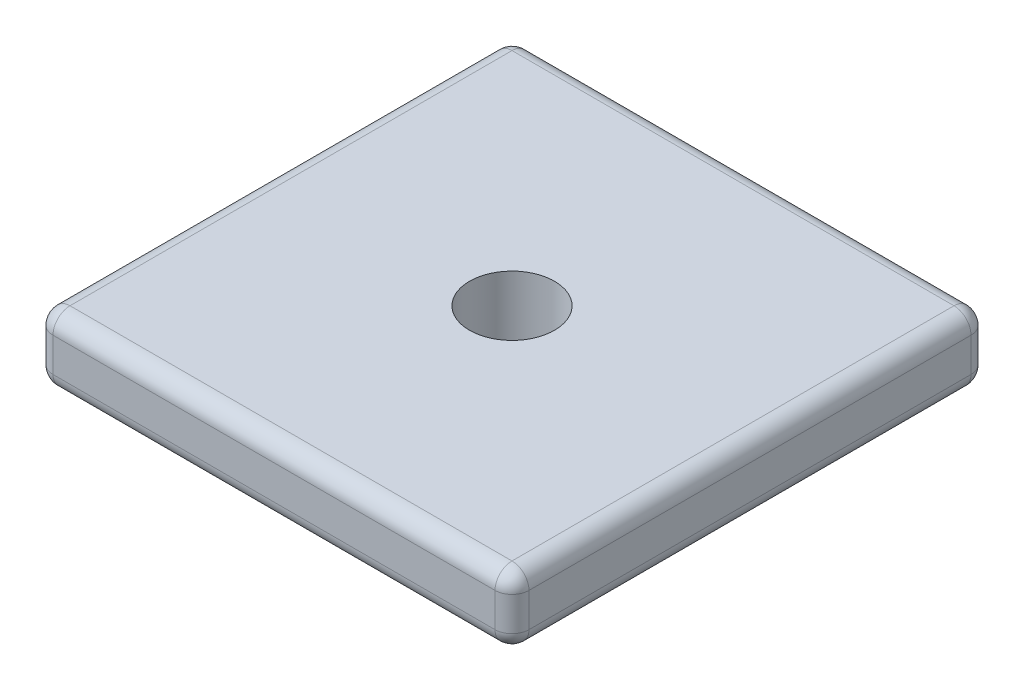
ISO-10303-21;
HEADER;
FILE_DESCRIPTION(('STEP AP214'),'2;1');
FILE_NAME('part.step','',(''),(''),'','','');
FILE_SCHEMA(('AUTOMOTIVE_DESIGN { 1 0 10303 214 1 1 1 1 }'));
ENDSEC;
DATA;
#1=APPLICATION_CONTEXT('core data for automotive mechanical design processes');
#2=APPLICATION_PROTOCOL_DEFINITION('international standard','automotive_design',2000,#1);
#3=PRODUCT_CONTEXT('',#1,'mechanical');
#4=PRODUCT('Part','Part','',(#3));
#5=PRODUCT_RELATED_PRODUCT_CATEGORY('part','',(#4));
#6=PRODUCT_DEFINITION_FORMATION('','',#4);
#7=PRODUCT_DEFINITION_CONTEXT('part definition',#1,'design');
#8=PRODUCT_DEFINITION('design','',#6,#7);
#9=PRODUCT_DEFINITION_SHAPE('','',#8);
#10=(LENGTH_UNIT() NAMED_UNIT(*) SI_UNIT(.MILLI.,.METRE.));
#11=(NAMED_UNIT(*) PLANE_ANGLE_UNIT() SI_UNIT($,.RADIAN.));
#12=(NAMED_UNIT(*) SI_UNIT($,.STERADIAN.) SOLID_ANGLE_UNIT());
#13=UNCERTAINTY_MEASURE_WITH_UNIT(LENGTH_MEASURE(1.E-05),#10,'distance_accuracy_value','');
#14=(GEOMETRIC_REPRESENTATION_CONTEXT(3) GLOBAL_UNCERTAINTY_ASSIGNED_CONTEXT((#13)) GLOBAL_UNIT_ASSIGNED_CONTEXT((#10,
#11,#12)) REPRESENTATION_CONTEXT('',''));
#15=CARTESIAN_POINT('',(0.,0.,0.));
#16=DIRECTION('',(0.,0.,1.));
#17=DIRECTION('',(1.,0.,0.));
#18=AXIS2_PLACEMENT_3D('',#15,#16,#17);
#19=CARTESIAN_POINT('',(-84.1666666666667,2.,-56.));
#20=DIRECTION('',(1.,0.,0.));
#21=DIRECTION('',(0.,0.,-1.));
#22=AXIS2_PLACEMENT_3D('',#19,#20,#21);
#23=PLANE('',#22);
#24=DIRECTION('',(0.,0.,1.));
#25=VECTOR('',#24,1.);
#26=CARTESIAN_POINT('',(-84.1666666666667,1.5,-70.));
#27=LINE('',#26,#25);
#28=CARTESIAN_POINT('',(-84.1666666666667,1.5,-56.5));
#29=VERTEX_POINT('',#28);
#30=CARTESIAN_POINT('',(-84.1666666666667,1.5,-69.5));
#31=VERTEX_POINT('',#30);
#32=EDGE_CURVE('E124',#29,#31,#27,.F.);
#33=ORIENTED_EDGE('',*,*,#32,.T.);
#34=DIRECTION('',(0.,-1.,0.));
#35=VECTOR('',#34,1.);
#36=CARTESIAN_POINT('',(-84.1666666666667,2.,-69.5));
#37=LINE('',#36,#35);
#38=CARTESIAN_POINT('',(-84.1666666666667,0.5,-69.5));
#39=VERTEX_POINT('',#38);
#40=EDGE_CURVE('E164',#31,#39,#37,.T.);
#41=ORIENTED_EDGE('',*,*,#40,.T.);
#42=DIRECTION('',(0.,0.,1.));
#43=VECTOR('',#42,1.);
#44=CARTESIAN_POINT('',(-84.1666666666667,0.5,-56.));
#45=LINE('',#44,#43);
#46=CARTESIAN_POINT('',(-84.1666666666667,0.5,-56.5));
#47=VERTEX_POINT('',#46);
#48=EDGE_CURVE('E127',#39,#47,#45,.T.);
#49=ORIENTED_EDGE('',*,*,#48,.T.);
#50=DIRECTION('',(0.,-1.,0.));
#51=VECTOR('',#50,1.);
#52=CARTESIAN_POINT('',(-84.1666666666667,2.,-56.5));
#53=LINE('',#52,#51);
#54=EDGE_CURVE('E120',#47,#29,#53,.F.);
#55=ORIENTED_EDGE('',*,*,#54,.T.);
#56=EDGE_LOOP('',(#33,#41,#49,#55));
#57=FACE_BOUND('',#56,.T.);
#58=ADVANCED_FACE('F33',(#57),#23,.F.);
#59=CARTESIAN_POINT('',(-70.1666666666667,2.,-56.));
#60=DIRECTION('',(0.,0.,-1.));
#61=DIRECTION('',(-1.,0.,0.));
#62=AXIS2_PLACEMENT_3D('',#59,#60,#61);
#63=PLANE('',#62);
#64=DIRECTION('',(1.,0.,0.));
#65=VECTOR('',#64,1.);
#66=CARTESIAN_POINT('',(-84.1666666666667,1.5,-56.));
#67=LINE('',#66,#65);
#68=CARTESIAN_POINT('',(-70.6666666666667,1.5,-56.));
#69=VERTEX_POINT('',#68);
#70=CARTESIAN_POINT('',(-83.6666666666667,1.5,-56.));
#71=VERTEX_POINT('',#70);
#72=EDGE_CURVE('E186',#69,#71,#67,.F.);
#73=ORIENTED_EDGE('',*,*,#72,.T.);
#74=DIRECTION('',(0.,-1.,0.));
#75=VECTOR('',#74,1.);
#76=CARTESIAN_POINT('',(-83.6666666666667,2.,-56.));
#77=LINE('',#76,#75);
#78=CARTESIAN_POINT('',(-83.6666666666667,0.5,-56.));
#79=VERTEX_POINT('',#78);
#80=EDGE_CURVE('E138',#71,#79,#77,.T.);
#81=ORIENTED_EDGE('',*,*,#80,.T.);
#82=DIRECTION('',(1.,0.,0.));
#83=VECTOR('',#82,1.);
#84=CARTESIAN_POINT('',(-70.1666666666667,0.5,-56.));
#85=LINE('',#84,#83);
#86=CARTESIAN_POINT('',(-70.6666666666667,0.5,-56.));
#87=VERTEX_POINT('',#86);
#88=EDGE_CURVE('E188',#79,#87,#85,.T.);
#89=ORIENTED_EDGE('',*,*,#88,.T.);
#90=DIRECTION('',(0.,-1.,0.));
#91=VECTOR('',#90,1.);
#92=CARTESIAN_POINT('',(-70.6666666666667,2.,-56.));
#93=LINE('',#92,#91);
#94=EDGE_CURVE('E184',#87,#69,#93,.F.);
#95=ORIENTED_EDGE('',*,*,#94,.T.);
#96=EDGE_LOOP('',(#73,#81,#89,#95));
#97=FACE_BOUND('',#96,.T.);
#98=ADVANCED_FACE('F296',(#97),#63,.F.);
#99=CARTESIAN_POINT('',(-70.1666666666667,2.,-56.));
#100=DIRECTION('',(-1.,0.,0.));
#101=DIRECTION('',(0.,0.,1.));
#102=AXIS2_PLACEMENT_3D('',#99,#100,#101);
#103=PLANE('',#102);
#104=DIRECTION('',(0.,0.,-1.));
#105=VECTOR('',#104,1.);
#106=CARTESIAN_POINT('',(-70.1666666666667,1.5,-56.));
#107=LINE('',#106,#105);
#108=CARTESIAN_POINT('',(-70.1666666666667,1.5,-69.5));
#109=VERTEX_POINT('',#108);
#110=CARTESIAN_POINT('',(-70.1666666666667,1.5,-56.5));
#111=VERTEX_POINT('',#110);
#112=EDGE_CURVE('E42',#109,#111,#107,.F.);
#113=ORIENTED_EDGE('',*,*,#112,.T.);
#114=DIRECTION('',(0.,-1.,0.));
#115=VECTOR('',#114,1.);
#116=CARTESIAN_POINT('',(-70.1666666666667,2.,-56.5));
#117=LINE('',#116,#115);
#118=CARTESIAN_POINT('',(-70.1666666666667,0.5,-56.5));
#119=VERTEX_POINT('',#118);
#120=EDGE_CURVE('E11',#111,#119,#117,.T.);
#121=ORIENTED_EDGE('',*,*,#120,.T.);
#122=DIRECTION('',(0.,0.,-1.));
#123=VECTOR('',#122,1.);
#124=CARTESIAN_POINT('',(-70.1666666666667,0.5,-56.));
#125=LINE('',#124,#123);
#126=CARTESIAN_POINT('',(-70.1666666666667,0.5,-69.5));
#127=VERTEX_POINT('',#126);
#128=EDGE_CURVE('E200',#119,#127,#125,.T.);
#129=ORIENTED_EDGE('',*,*,#128,.T.);
#130=DIRECTION('',(0.,-1.,0.));
#131=VECTOR('',#130,1.);
#132=CARTESIAN_POINT('',(-70.1666666666667,2.,-69.5));
#133=LINE('',#132,#131);
#134=EDGE_CURVE('E53',#127,#109,#133,.F.);
#135=ORIENTED_EDGE('',*,*,#134,.T.);
#136=EDGE_LOOP('',(#113,#121,#129,#135));
#137=FACE_BOUND('',#136,.T.);
#138=ADVANCED_FACE('F274',(#137),#103,.F.);
#139=CARTESIAN_POINT('',(-70.1666666666667,2.,-70.));
#140=DIRECTION('',(0.,0.,1.));
#141=DIRECTION('',(1.,0.,0.));
#142=AXIS2_PLACEMENT_3D('',#139,#140,#141);
#143=PLANE('',#142);
#144=DIRECTION('',(-1.,0.,0.));
#145=VECTOR('',#144,1.);
#146=CARTESIAN_POINT('',(-70.1666666666667,0.5,-70.));
#147=LINE('',#146,#145);
#148=CARTESIAN_POINT('',(-70.6666666666667,0.5,-70.));
#149=VERTEX_POINT('',#148);
#150=CARTESIAN_POINT('',(-83.6666666666667,0.5,-70.));
#151=VERTEX_POINT('',#150);
#152=EDGE_CURVE('E170',#149,#151,#147,.T.);
#153=ORIENTED_EDGE('',*,*,#152,.T.);
#154=DIRECTION('',(0.,-1.,0.));
#155=VECTOR('',#154,1.);
#156=CARTESIAN_POINT('',(-83.6666666666667,2.,-70.));
#157=LINE('',#156,#155);
#158=CARTESIAN_POINT('',(-83.6666666666667,1.5,-70.));
#159=VERTEX_POINT('',#158);
#160=EDGE_CURVE('E172',#151,#159,#157,.F.);
#161=ORIENTED_EDGE('',*,*,#160,.T.);
#162=DIRECTION('',(-1.,0.,0.));
#163=VECTOR('',#162,1.);
#164=CARTESIAN_POINT('',(-70.1666666666667,1.5,-70.));
#165=LINE('',#164,#163);
#166=CARTESIAN_POINT('',(-70.6666666666667,1.5,-70.));
#167=VERTEX_POINT('',#166);
#168=EDGE_CURVE('E168',#159,#167,#165,.F.);
#169=ORIENTED_EDGE('',*,*,#168,.T.);
#170=DIRECTION('',(0.,-1.,0.));
#171=VECTOR('',#170,1.);
#172=CARTESIAN_POINT('',(-70.6666666666667,2.,-70.));
#173=LINE('',#172,#171);
#174=EDGE_CURVE('E166',#167,#149,#173,.T.);
#175=ORIENTED_EDGE('',*,*,#174,.T.);
#176=EDGE_LOOP('',(#153,#161,#169,#175));
#177=FACE_BOUND('',#176,.T.);
#178=ADVANCED_FACE('F409',(#177),#143,.F.);
#179=CARTESIAN_POINT('',(0.,2.,0.));
#180=DIRECTION('',(0.,1.,0.));
#181=DIRECTION('',(0.,0.,1.));
#182=AXIS2_PLACEMENT_3D('',#179,#180,#181);
#183=PLANE('',#182);
#184=CARTESIAN_POINT('',(-77.1666666666667,2.,-63.));
#185=DIRECTION('',(0.,1.,0.));
#186=DIRECTION('',(0.,0.,1.));
#187=AXIS2_PLACEMENT_3D('',#184,#185,#186);
#188=CIRCLE('',#187,1.25);
#189=CARTESIAN_POINT('',(-77.1666666666667,2.,-61.75));
#190=VERTEX_POINT('',#189);
#191=EDGE_CURVE('E160',#190,#190,#188,.T.);
#192=ORIENTED_EDGE('',*,*,#191,.F.);
#193=EDGE_LOOP('',(#192));
#194=FACE_BOUND('',#193,.T.);
#195=DIRECTION('',(-1.,0.,0.));
#196=VECTOR('',#195,1.);
#197=CARTESIAN_POINT('',(-84.1666666666667,2.,-69.5));
#198=LINE('',#197,#196);
#199=CARTESIAN_POINT('',(-70.6666666666667,2.,-69.5));
#200=VERTEX_POINT('',#199);
#201=CARTESIAN_POINT('',(-83.6666666666667,2.,-69.5));
#202=VERTEX_POINT('',#201);
#203=EDGE_CURVE('E195',#200,#202,#198,.T.);
#204=ORIENTED_EDGE('',*,*,#203,.T.);
#205=DIRECTION('',(0.,0.,1.));
#206=VECTOR('',#205,1.);
#207=CARTESIAN_POINT('',(-83.6666666666667,2.,-56.));
#208=LINE('',#207,#206);
#209=CARTESIAN_POINT('',(-83.6666666666667,2.,-56.5));
#210=VERTEX_POINT('',#209);
#211=EDGE_CURVE('E198',#202,#210,#208,.T.);
#212=ORIENTED_EDGE('',*,*,#211,.T.);
#213=DIRECTION('',(1.,0.,0.));
#214=VECTOR('',#213,1.);
#215=CARTESIAN_POINT('',(-70.1666666666667,2.,-56.5));
#216=LINE('',#215,#214);
#217=CARTESIAN_POINT('',(-70.6666666666667,2.,-56.5));
#218=VERTEX_POINT('',#217);
#219=EDGE_CURVE('E193',#210,#218,#216,.T.);
#220=ORIENTED_EDGE('',*,*,#219,.T.);
#221=DIRECTION('',(0.,0.,-1.));
#222=VECTOR('',#221,1.);
#223=CARTESIAN_POINT('',(-70.6666666666667,2.,-70.));
#224=LINE('',#223,#222);
#225=EDGE_CURVE('E191',#218,#200,#224,.T.);
#226=ORIENTED_EDGE('',*,*,#225,.T.);
#227=EDGE_LOOP('',(#204,#212,#220,#226));
#228=FACE_BOUND('',#227,.T.);
#229=ADVANCED_FACE('F301',(#194,#228),#183,.T.);
#230=CARTESIAN_POINT('',(0.,0.,0.));
#231=DIRECTION('',(0.,1.,0.));
#232=DIRECTION('',(0.,0.,1.));
#233=AXIS2_PLACEMENT_3D('',#230,#231,#232);
#234=PLANE('',#233);
#235=CARTESIAN_POINT('',(-77.1666666666667,0.,-63.));
#236=DIRECTION('',(0.,1.,0.));
#237=DIRECTION('',(0.,0.,1.));
#238=AXIS2_PLACEMENT_3D('',#235,#236,#237);
#239=CIRCLE('',#238,1.25);
#240=CARTESIAN_POINT('',(-77.1666666666667,0.,-61.75));
#241=VERTEX_POINT('',#240);
#242=EDGE_CURVE('E207',#241,#241,#239,.T.);
#243=ORIENTED_EDGE('',*,*,#242,.T.);
#244=EDGE_LOOP('',(#243));
#245=FACE_BOUND('',#244,.T.);
#246=DIRECTION('',(0.,0.,1.));
#247=VECTOR('',#246,1.);
#248=CARTESIAN_POINT('',(-83.6666666666667,0.,0.));
#249=LINE('',#248,#247);
#250=CARTESIAN_POINT('',(-83.6666666666667,0.,-56.5));
#251=VERTEX_POINT('',#250);
#252=CARTESIAN_POINT('',(-83.6666666666667,0.,-69.5));
#253=VERTEX_POINT('',#252);
#254=EDGE_CURVE('E179',#251,#253,#249,.F.);
#255=ORIENTED_EDGE('',*,*,#254,.T.);
#256=DIRECTION('',(-1.,0.,0.));
#257=VECTOR('',#256,1.);
#258=CARTESIAN_POINT('',(0.,0.,-69.5000000000001));
#259=LINE('',#258,#257);
#260=CARTESIAN_POINT('',(-70.6666666666667,0.,-69.5));
#261=VERTEX_POINT('',#260);
#262=EDGE_CURVE('E181',#253,#261,#259,.F.);
#263=ORIENTED_EDGE('',*,*,#262,.T.);
#264=DIRECTION('',(0.,0.,-1.));
#265=VECTOR('',#264,1.);
#266=CARTESIAN_POINT('',(-70.6666666666668,0.,0.));
#267=LINE('',#266,#265);
#268=CARTESIAN_POINT('',(-70.6666666666667,0.,-56.5));
#269=VERTEX_POINT('',#268);
#270=EDGE_CURVE('E175',#261,#269,#267,.F.);
#271=ORIENTED_EDGE('',*,*,#270,.T.);
#272=DIRECTION('',(1.,0.,0.));
#273=VECTOR('',#272,1.);
#274=CARTESIAN_POINT('',(0.,0.,-56.5000000000001));
#275=LINE('',#274,#273);
#276=EDGE_CURVE('E177',#269,#251,#275,.F.);
#277=ORIENTED_EDGE('',*,*,#276,.T.);
#278=EDGE_LOOP('',(#255,#263,#271,#277));
#279=FACE_BOUND('',#278,.T.);
#280=ADVANCED_FACE('F267',(#245,#279),#234,.F.);
#281=CARTESIAN_POINT('',(-70.6666666666667,2.,-56.5));
#282=DIRECTION('',(0.,-1.,0.));
#283=DIRECTION('',(0.,0.,-1.));
#284=AXIS2_PLACEMENT_3D('',#281,#282,#283);
#285=CYLINDRICAL_SURFACE('',#284,0.5);
#286=CARTESIAN_POINT('',(-70.6666666666667,1.5,-56.5));
#287=DIRECTION('',(0.,1.,0.));
#288=DIRECTION('',(0.,0.,1.));
#289=AXIS2_PLACEMENT_3D('',#286,#287,#288);
#290=CIRCLE('',#289,0.5);
#291=EDGE_CURVE('E37',#69,#111,#290,.T.);
#292=ORIENTED_EDGE('',*,*,#291,.F.);
#293=ORIENTED_EDGE('',*,*,#94,.F.);
#294=CARTESIAN_POINT('',(-70.6666666666667,0.5,-56.5));
#295=DIRECTION('',(0.,-1.,0.));
#296=DIRECTION('',(0.,0.,-1.));
#297=AXIS2_PLACEMENT_3D('',#294,#295,#296);
#298=CIRCLE('',#297,0.5);
#299=EDGE_CURVE('E158',#119,#87,#298,.T.);
#300=ORIENTED_EDGE('',*,*,#299,.F.);
#301=ORIENTED_EDGE('',*,*,#120,.F.);
#302=EDGE_LOOP('',(#292,#293,#300,#301));
#303=FACE_BOUND('',#302,.T.);
#304=ADVANCED_FACE('F35',(#303),#285,.T.);
#305=CARTESIAN_POINT('',(-70.6666666666667,1.5,-56.5));
#306=DIRECTION('',(0.,0.,1.));
#307=DIRECTION('',(1.,0.,0.));
#308=AXIS2_PLACEMENT_3D('',#305,#306,#307);
#309=SPHERICAL_SURFACE('',#308,0.5);
#310=CARTESIAN_POINT('',(-70.6666666666667,1.5,-56.5));
#311=DIRECTION('',(1.,0.,0.));
#312=DIRECTION('',(0.,0.,-1.));
#313=AXIS2_PLACEMENT_3D('',#310,#311,#312);
#314=CIRCLE('',#313,0.5);
#315=EDGE_CURVE('E247',#69,#218,#314,.F.);
#316=ORIENTED_EDGE('',*,*,#315,.F.);
#317=ORIENTED_EDGE('',*,*,#291,.T.);
#318=CARTESIAN_POINT('',(-70.6666666666667,1.5,-56.5));
#319=DIRECTION('',(0.,0.,1.));
#320=DIRECTION('',(1.,0.,0.));
#321=AXIS2_PLACEMENT_3D('',#318,#319,#320);
#322=CIRCLE('',#321,0.5);
#323=EDGE_CURVE('E250',#218,#111,#322,.F.);
#324=ORIENTED_EDGE('',*,*,#323,.F.);
#325=EDGE_LOOP('',(#316,#317,#324));
#326=FACE_BOUND('',#325,.T.);
#327=ADVANCED_FACE('F292',(#326),#309,.T.);
#328=CARTESIAN_POINT('',(-70.6666666666667,0.5,-56.5));
#329=DIRECTION('',(0.,0.,1.));
#330=DIRECTION('',(1.,0.,0.));
#331=AXIS2_PLACEMENT_3D('',#328,#329,#330);
#332=SPHERICAL_SURFACE('',#331,0.5);
#333=CARTESIAN_POINT('',(-70.6666666666667,0.5,-56.5));
#334=DIRECTION('',(0.,0.,1.));
#335=DIRECTION('',(1.,0.,0.));
#336=AXIS2_PLACEMENT_3D('',#333,#334,#335);
#337=CIRCLE('',#336,0.5);
#338=EDGE_CURVE('E241',#119,#269,#337,.F.);
#339=ORIENTED_EDGE('',*,*,#338,.F.);
#340=ORIENTED_EDGE('',*,*,#299,.T.);
#341=CARTESIAN_POINT('',(-70.6666666666667,0.5,-56.5));
#342=DIRECTION('',(1.,0.,0.));
#343=DIRECTION('',(0.,0.,-1.));
#344=AXIS2_PLACEMENT_3D('',#341,#342,#343);
#345=CIRCLE('',#344,0.5);
#346=EDGE_CURVE('E244',#269,#87,#345,.F.);
#347=ORIENTED_EDGE('',*,*,#346,.F.);
#348=EDGE_LOOP('',(#339,#340,#347));
#349=FACE_BOUND('',#348,.T.);
#350=ADVANCED_FACE('F257',(#349),#332,.T.);
#351=CARTESIAN_POINT('',(-70.6666666666668,1.5,0.));
#352=DIRECTION('',(0.,0.,1.));
#353=DIRECTION('',(1.,0.,0.));
#354=AXIS2_PLACEMENT_3D('',#351,#352,#353);
#355=CYLINDRICAL_SURFACE('',#354,0.5);
#356=ORIENTED_EDGE('',*,*,#323,.T.);
#357=ORIENTED_EDGE('',*,*,#112,.F.);
#358=CARTESIAN_POINT('',(-70.6666666666667,1.5,-69.5));
#359=DIRECTION('',(0.,0.,-1.));
#360=DIRECTION('',(-1.,0.,0.));
#361=AXIS2_PLACEMENT_3D('',#358,#359,#360);
#362=CIRCLE('',#361,0.5);
#363=EDGE_CURVE('E235',#200,#109,#362,.T.);
#364=ORIENTED_EDGE('',*,*,#363,.F.);
#365=ORIENTED_EDGE('',*,*,#225,.F.);
#366=EDGE_LOOP('',(#356,#357,#364,#365));
#367=FACE_BOUND('',#366,.T.);
#368=ADVANCED_FACE('F288',(#367),#355,.T.);
#369=CARTESIAN_POINT('',(0.,1.5,-56.5000000000001));
#370=DIRECTION('',(-1.,0.,0.));
#371=DIRECTION('',(0.,0.,1.));
#372=AXIS2_PLACEMENT_3D('',#369,#370,#371);
#373=CYLINDRICAL_SURFACE('',#372,0.5);
#374=ORIENTED_EDGE('',*,*,#315,.T.);
#375=ORIENTED_EDGE('',*,*,#219,.F.);
#376=CARTESIAN_POINT('',(-83.6666666666667,1.5,-56.5));
#377=DIRECTION('',(-1.,0.,0.));
#378=DIRECTION('',(0.,0.,1.));
#379=AXIS2_PLACEMENT_3D('',#376,#377,#378);
#380=CIRCLE('',#379,0.5);
#381=EDGE_CURVE('E142',#71,#210,#380,.T.);
#382=ORIENTED_EDGE('',*,*,#381,.F.);
#383=ORIENTED_EDGE('',*,*,#72,.F.);
#384=EDGE_LOOP('',(#374,#375,#382,#383));
#385=FACE_BOUND('',#384,.T.);
#386=ADVANCED_FACE('F298',(#385),#373,.T.);
#387=CARTESIAN_POINT('',(-83.6666666666667,2.,-56.5));
#388=DIRECTION('',(0.,-1.,0.));
#389=DIRECTION('',(0.,0.,-1.));
#390=AXIS2_PLACEMENT_3D('',#387,#388,#389);
#391=CYLINDRICAL_SURFACE('',#390,0.5);
#392=CARTESIAN_POINT('',(-83.6666666666667,0.5,-56.5));
#393=DIRECTION('',(0.,-1.,0.));
#394=DIRECTION('',(0.,0.,-1.));
#395=AXIS2_PLACEMENT_3D('',#392,#393,#394);
#396=CIRCLE('',#395,0.5);
#397=EDGE_CURVE('E143',#79,#47,#396,.T.);
#398=ORIENTED_EDGE('',*,*,#397,.F.);
#399=ORIENTED_EDGE('',*,*,#80,.F.);
#400=CARTESIAN_POINT('',(-83.6666666666667,1.5,-56.5));
#401=DIRECTION('',(0.,1.,0.));
#402=DIRECTION('',(0.,0.,1.));
#403=AXIS2_PLACEMENT_3D('',#400,#401,#402);
#404=CIRCLE('',#403,0.5);
#405=EDGE_CURVE('E134',#29,#71,#404,.T.);
#406=ORIENTED_EDGE('',*,*,#405,.F.);
#407=ORIENTED_EDGE('',*,*,#54,.F.);
#408=EDGE_LOOP('',(#398,#399,#406,#407));
#409=FACE_BOUND('',#408,.T.);
#410=ADVANCED_FACE('F136',(#409),#391,.T.);
#411=CARTESIAN_POINT('',(-70.1666666666667,0.5,-56.5));
#412=DIRECTION('',(1.,0.,0.));
#413=DIRECTION('',(0.,0.,-1.));
#414=AXIS2_PLACEMENT_3D('',#411,#412,#413);
#415=CYLINDRICAL_SURFACE('',#414,0.5);
#416=ORIENTED_EDGE('',*,*,#346,.T.);
#417=ORIENTED_EDGE('',*,*,#88,.F.);
#418=CARTESIAN_POINT('',(-83.6666666666667,0.5,-56.5));
#419=DIRECTION('',(-1.,0.,0.));
#420=DIRECTION('',(0.,0.,1.));
#421=AXIS2_PLACEMENT_3D('',#418,#419,#420);
#422=CIRCLE('',#421,0.5);
#423=EDGE_CURVE('E231',#251,#79,#422,.T.);
#424=ORIENTED_EDGE('',*,*,#423,.F.);
#425=ORIENTED_EDGE('',*,*,#276,.F.);
#426=EDGE_LOOP('',(#416,#417,#424,#425));
#427=FACE_BOUND('',#426,.T.);
#428=ADVANCED_FACE('F263',(#427),#415,.T.);
#429=CARTESIAN_POINT('',(-70.6666666666667,0.5,-56.));
#430=DIRECTION('',(0.,0.,-1.));
#431=DIRECTION('',(-1.,0.,0.));
#432=AXIS2_PLACEMENT_3D('',#429,#430,#431);
#433=CYLINDRICAL_SURFACE('',#432,0.5);
#434=ORIENTED_EDGE('',*,*,#338,.T.);
#435=ORIENTED_EDGE('',*,*,#270,.F.);
#436=CARTESIAN_POINT('',(-70.6666666666667,0.5,-69.5));
#437=DIRECTION('',(0.,0.,-1.));
#438=DIRECTION('',(-1.,0.,0.));
#439=AXIS2_PLACEMENT_3D('',#436,#437,#438);
#440=CIRCLE('',#439,0.5);
#441=EDGE_CURVE('E228',#127,#261,#440,.T.);
#442=ORIENTED_EDGE('',*,*,#441,.F.);
#443=ORIENTED_EDGE('',*,*,#128,.F.);
#444=EDGE_LOOP('',(#434,#435,#442,#443));
#445=FACE_BOUND('',#444,.T.);
#446=ADVANCED_FACE('F273',(#445),#433,.T.);
#447=CARTESIAN_POINT('',(-70.6666666666667,2.,-69.5));
#448=DIRECTION('',(0.,-1.,0.));
#449=DIRECTION('',(0.,0.,-1.));
#450=AXIS2_PLACEMENT_3D('',#447,#448,#449);
#451=CYLINDRICAL_SURFACE('',#450,0.5);
#452=CARTESIAN_POINT('',(-70.6666666666667,1.5,-69.5));
#453=DIRECTION('',(0.,1.,0.));
#454=DIRECTION('',(0.,0.,1.));
#455=AXIS2_PLACEMENT_3D('',#452,#453,#454);
#456=CIRCLE('',#455,0.5);
#457=EDGE_CURVE('E238',#109,#167,#456,.T.);
#458=ORIENTED_EDGE('',*,*,#457,.F.);
#459=ORIENTED_EDGE('',*,*,#134,.F.);
#460=CARTESIAN_POINT('',(-70.6666666666667,0.5,-69.5));
#461=DIRECTION('',(0.,-1.,0.));
#462=DIRECTION('',(0.,0.,-1.));
#463=AXIS2_PLACEMENT_3D('',#460,#461,#462);
#464=CIRCLE('',#463,0.5);
#465=EDGE_CURVE('E225',#149,#127,#464,.T.);
#466=ORIENTED_EDGE('',*,*,#465,.F.);
#467=ORIENTED_EDGE('',*,*,#174,.F.);
#468=EDGE_LOOP('',(#458,#459,#466,#467));
#469=FACE_BOUND('',#468,.T.);
#470=ADVANCED_FACE('F278',(#469),#451,.T.);
#471=CARTESIAN_POINT('',(-70.6666666666667,1.5,-69.5));
#472=DIRECTION('',(0.,0.,1.));
#473=DIRECTION('',(1.,0.,0.));
#474=AXIS2_PLACEMENT_3D('',#471,#472,#473);
#475=SPHERICAL_SURFACE('',#474,0.5);
#476=ORIENTED_EDGE('',*,*,#363,.T.);
#477=ORIENTED_EDGE('',*,*,#457,.T.);
#478=CARTESIAN_POINT('',(-70.6666666666667,1.5,-69.5));
#479=DIRECTION('',(1.,0.,0.));
#480=DIRECTION('',(0.,0.,-1.));
#481=AXIS2_PLACEMENT_3D('',#478,#479,#480);
#482=CIRCLE('',#481,0.5);
#483=EDGE_CURVE('E150',#200,#167,#482,.F.);
#484=ORIENTED_EDGE('',*,*,#483,.F.);
#485=EDGE_LOOP('',(#476,#477,#484));
#486=FACE_BOUND('',#485,.T.);
#487=ADVANCED_FACE('F284',(#486),#475,.T.);
#488=CARTESIAN_POINT('',(-83.6666666666667,1.5,-56.5));
#489=DIRECTION('',(0.,0.,1.));
#490=DIRECTION('',(1.,0.,0.));
#491=AXIS2_PLACEMENT_3D('',#488,#489,#490);
#492=SPHERICAL_SURFACE('',#491,0.5);
#493=ORIENTED_EDGE('',*,*,#405,.T.);
#494=ORIENTED_EDGE('',*,*,#381,.T.);
#495=CARTESIAN_POINT('',(-83.6666666666667,1.5,-56.5));
#496=DIRECTION('',(0.,0.,1.));
#497=DIRECTION('',(1.,0.,0.));
#498=AXIS2_PLACEMENT_3D('',#495,#496,#497);
#499=CIRCLE('',#498,0.5);
#500=EDGE_CURVE('E146',#29,#210,#499,.F.);
#501=ORIENTED_EDGE('',*,*,#500,.F.);
#502=EDGE_LOOP('',(#493,#494,#501));
#503=FACE_BOUND('',#502,.T.);
#504=ADVANCED_FACE('F147',(#503),#492,.T.);
#505=CARTESIAN_POINT('',(-83.6666666666667,0.5,-56.5));
#506=DIRECTION('',(0.,0.,1.));
#507=DIRECTION('',(1.,0.,0.));
#508=AXIS2_PLACEMENT_3D('',#505,#506,#507);
#509=SPHERICAL_SURFACE('',#508,0.5);
#510=ORIENTED_EDGE('',*,*,#423,.T.);
#511=ORIENTED_EDGE('',*,*,#397,.T.);
#512=CARTESIAN_POINT('',(-83.6666666666667,0.5,-56.5));
#513=DIRECTION('',(0.,0.,1.));
#514=DIRECTION('',(1.,0.,0.));
#515=AXIS2_PLACEMENT_3D('',#512,#513,#514);
#516=CIRCLE('',#515,0.5);
#517=EDGE_CURVE('E151',#251,#47,#516,.F.);
#518=ORIENTED_EDGE('',*,*,#517,.F.);
#519=EDGE_LOOP('',(#510,#511,#518));
#520=FACE_BOUND('',#519,.T.);
#521=ADVANCED_FACE('F320',(#520),#509,.T.);
#522=CARTESIAN_POINT('',(-70.6666666666667,0.5,-69.5));
#523=DIRECTION('',(0.,0.,1.));
#524=DIRECTION('',(1.,0.,0.));
#525=AXIS2_PLACEMENT_3D('',#522,#523,#524);
#526=SPHERICAL_SURFACE('',#525,0.5);
#527=ORIENTED_EDGE('',*,*,#465,.T.);
#528=ORIENTED_EDGE('',*,*,#441,.T.);
#529=CARTESIAN_POINT('',(-70.6666666666667,0.5,-69.5));
#530=DIRECTION('',(1.,0.,0.));
#531=DIRECTION('',(0.,0.,-1.));
#532=AXIS2_PLACEMENT_3D('',#529,#530,#531);
#533=CIRCLE('',#532,0.5);
#534=EDGE_CURVE('E219',#149,#261,#533,.F.);
#535=ORIENTED_EDGE('',*,*,#534,.F.);
#536=EDGE_LOOP('',(#527,#528,#535));
#537=FACE_BOUND('',#536,.T.);
#538=ADVANCED_FACE('F322',(#537),#526,.T.);
#539=CARTESIAN_POINT('',(0.,1.5,-69.5000000000001));
#540=DIRECTION('',(1.,0.,0.));
#541=DIRECTION('',(0.,0.,-1.));
#542=AXIS2_PLACEMENT_3D('',#539,#540,#541);
#543=CYLINDRICAL_SURFACE('',#542,0.5);
#544=ORIENTED_EDGE('',*,*,#483,.T.);
#545=ORIENTED_EDGE('',*,*,#168,.F.);
#546=CARTESIAN_POINT('',(-83.6666666666667,1.5,-69.5));
#547=DIRECTION('',(-1.,0.,0.));
#548=DIRECTION('',(0.,0.,1.));
#549=AXIS2_PLACEMENT_3D('',#546,#547,#548);
#550=CIRCLE('',#549,0.5);
#551=EDGE_CURVE('E216',#202,#159,#550,.T.);
#552=ORIENTED_EDGE('',*,*,#551,.F.);
#553=ORIENTED_EDGE('',*,*,#203,.F.);
#554=EDGE_LOOP('',(#544,#545,#552,#553));
#555=FACE_BOUND('',#554,.T.);
#556=ADVANCED_FACE('F304',(#555),#543,.T.);
#557=CARTESIAN_POINT('',(-83.6666666666667,1.5,0.));
#558=DIRECTION('',(0.,0.,-1.));
#559=DIRECTION('',(-1.,0.,0.));
#560=AXIS2_PLACEMENT_3D('',#557,#558,#559);
#561=CYLINDRICAL_SURFACE('',#560,0.5);
#562=ORIENTED_EDGE('',*,*,#500,.T.);
#563=ORIENTED_EDGE('',*,*,#211,.F.);
#564=CARTESIAN_POINT('',(-83.6666666666667,1.5,-69.5));
#565=DIRECTION('',(0.,0.,-1.));
#566=DIRECTION('',(-1.,0.,0.));
#567=AXIS2_PLACEMENT_3D('',#564,#565,#566);
#568=CIRCLE('',#567,0.5);
#569=EDGE_CURVE('E154',#31,#202,#568,.T.);
#570=ORIENTED_EDGE('',*,*,#569,.F.);
#571=ORIENTED_EDGE('',*,*,#32,.F.);
#572=EDGE_LOOP('',(#562,#563,#570,#571));
#573=FACE_BOUND('',#572,.T.);
#574=ADVANCED_FACE('F153',(#573),#561,.T.);
#575=CARTESIAN_POINT('',(-83.6666666666667,0.5,-56.));
#576=DIRECTION('',(0.,0.,1.));
#577=DIRECTION('',(1.,0.,0.));
#578=AXIS2_PLACEMENT_3D('',#575,#576,#577);
#579=CYLINDRICAL_SURFACE('',#578,0.5);
#580=ORIENTED_EDGE('',*,*,#517,.T.);
#581=ORIENTED_EDGE('',*,*,#48,.F.);
#582=CARTESIAN_POINT('',(-83.6666666666667,0.5,-69.5));
#583=DIRECTION('',(0.,0.,-1.));
#584=DIRECTION('',(-1.,0.,0.));
#585=AXIS2_PLACEMENT_3D('',#582,#583,#584);
#586=CIRCLE('',#585,0.5);
#587=EDGE_CURVE('E212',#253,#39,#586,.T.);
#588=ORIENTED_EDGE('',*,*,#587,.F.);
#589=ORIENTED_EDGE('',*,*,#254,.F.);
#590=EDGE_LOOP('',(#580,#581,#588,#589));
#591=FACE_BOUND('',#590,.T.);
#592=ADVANCED_FACE('F318',(#591),#579,.T.);
#593=CARTESIAN_POINT('',(-70.1666666666667,0.5,-69.5));
#594=DIRECTION('',(-1.,0.,0.));
#595=DIRECTION('',(0.,0.,1.));
#596=AXIS2_PLACEMENT_3D('',#593,#594,#595);
#597=CYLINDRICAL_SURFACE('',#596,0.5);
#598=ORIENTED_EDGE('',*,*,#534,.T.);
#599=ORIENTED_EDGE('',*,*,#262,.F.);
#600=CARTESIAN_POINT('',(-83.6666666666667,0.5,-69.5));
#601=DIRECTION('',(-1.,0.,0.));
#602=DIRECTION('',(0.,0.,1.));
#603=AXIS2_PLACEMENT_3D('',#600,#601,#602);
#604=CIRCLE('',#603,0.5);
#605=EDGE_CURVE('E209',#151,#253,#604,.T.);
#606=ORIENTED_EDGE('',*,*,#605,.F.);
#607=ORIENTED_EDGE('',*,*,#152,.F.);
#608=EDGE_LOOP('',(#598,#599,#606,#607));
#609=FACE_BOUND('',#608,.T.);
#610=ADVANCED_FACE('F346',(#609),#597,.T.);
#611=CARTESIAN_POINT('',(-83.6666666666667,1.5,-69.5));
#612=DIRECTION('',(0.,0.,1.));
#613=DIRECTION('',(1.,0.,0.));
#614=AXIS2_PLACEMENT_3D('',#611,#612,#613);
#615=SPHERICAL_SURFACE('',#614,0.5);
#616=ORIENTED_EDGE('',*,*,#569,.T.);
#617=ORIENTED_EDGE('',*,*,#551,.T.);
#618=CARTESIAN_POINT('',(-83.6666666666667,1.5,-69.5));
#619=DIRECTION('',(0.,1.,0.));
#620=DIRECTION('',(0.,0.,1.));
#621=AXIS2_PLACEMENT_3D('',#618,#619,#620);
#622=CIRCLE('',#621,0.5);
#623=EDGE_CURVE('E206',#31,#159,#622,.F.);
#624=ORIENTED_EDGE('',*,*,#623,.F.);
#625=EDGE_LOOP('',(#616,#617,#624));
#626=FACE_BOUND('',#625,.T.);
#627=ADVANCED_FACE('F307',(#626),#615,.T.);
#628=CARTESIAN_POINT('',(-83.6666666666667,0.5,-69.5));
#629=DIRECTION('',(0.,0.,1.));
#630=DIRECTION('',(1.,0.,0.));
#631=AXIS2_PLACEMENT_3D('',#628,#629,#630);
#632=SPHERICAL_SURFACE('',#631,0.5);
#633=ORIENTED_EDGE('',*,*,#605,.T.);
#634=ORIENTED_EDGE('',*,*,#587,.T.);
#635=CARTESIAN_POINT('',(-83.6666666666667,0.5,-69.5));
#636=DIRECTION('',(0.,-1.,0.));
#637=DIRECTION('',(0.,0.,-1.));
#638=AXIS2_PLACEMENT_3D('',#635,#636,#637);
#639=CIRCLE('',#638,0.5);
#640=EDGE_CURVE('E204',#151,#39,#639,.F.);
#641=ORIENTED_EDGE('',*,*,#640,.F.);
#642=EDGE_LOOP('',(#633,#634,#641));
#643=FACE_BOUND('',#642,.T.);
#644=ADVANCED_FACE('F315',(#643),#632,.T.);
#645=CARTESIAN_POINT('',(-83.6666666666667,2.,-69.5));
#646=DIRECTION('',(0.,-1.,0.));
#647=DIRECTION('',(0.,0.,-1.));
#648=AXIS2_PLACEMENT_3D('',#645,#646,#647);
#649=CYLINDRICAL_SURFACE('',#648,0.5);
#650=ORIENTED_EDGE('',*,*,#623,.T.);
#651=ORIENTED_EDGE('',*,*,#160,.F.);
#652=ORIENTED_EDGE('',*,*,#640,.T.);
#653=ORIENTED_EDGE('',*,*,#40,.F.);
#654=EDGE_LOOP('',(#650,#651,#652,#653));
#655=FACE_BOUND('',#654,.T.);
#656=ADVANCED_FACE('F311',(#655),#649,.T.);
#657=CARTESIAN_POINT('',(-77.1666666666667,0.,-63.));
#658=DIRECTION('',(0.,1.,0.));
#659=DIRECTION('',(0.,0.,1.));
#660=AXIS2_PLACEMENT_3D('',#657,#658,#659);
#661=CYLINDRICAL_SURFACE('',#660,1.25);
#662=ORIENTED_EDGE('',*,*,#242,.F.);
#663=EDGE_LOOP('',(#662));
#664=FACE_BOUND('',#663,.T.);
#665=ORIENTED_EDGE('',*,*,#191,.T.);
#666=EDGE_LOOP('',(#665));
#667=FACE_BOUND('',#666,.T.);
#668=ADVANCED_FACE('F341',(#664,#667),#661,.F.);
#669=CLOSED_SHELL('',(#58,#98,#138,#178,#229,#280,#304,#327,#350,#368,#386,#410,#428,#446,#470,
#487,#504,#521,#538,#556,#574,#592,#610,#627,#644,#656,#668));
#670=MANIFOLD_SOLID_BREP('B2',#669);
#671=ADVANCED_BREP_SHAPE_REPRESENTATION('',(#18,#670),#14);
#672=SHAPE_DEFINITION_REPRESENTATION(#9,#671);
ENDSEC;
END-ISO-10303-21;
